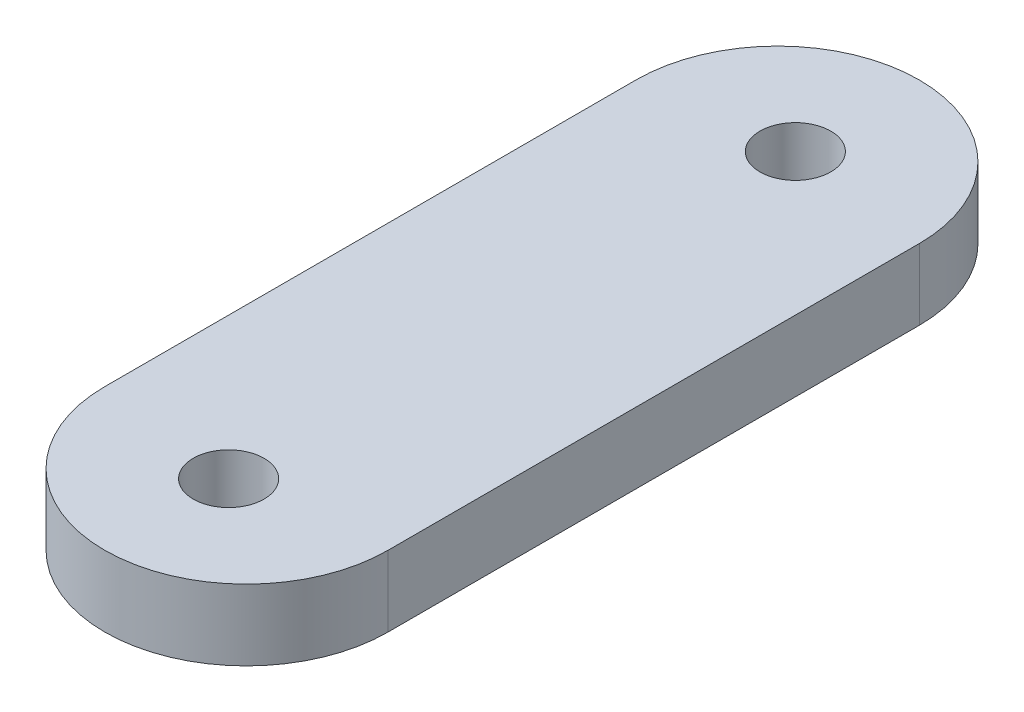
ISO-10303-21;
HEADER;
FILE_DESCRIPTION(('STEP AP214'),'2;1');
FILE_NAME('part.step','',(''),(''),'','','');
FILE_SCHEMA(('AUTOMOTIVE_DESIGN { 1 0 10303 214 1 1 1 1 }'));
ENDSEC;
DATA;
#1=APPLICATION_CONTEXT('core data for automotive mechanical design processes');
#2=APPLICATION_PROTOCOL_DEFINITION('international standard','automotive_design',2000,#1);
#3=PRODUCT_CONTEXT('',#1,'mechanical');
#4=PRODUCT('Part','Part','',(#3));
#5=PRODUCT_RELATED_PRODUCT_CATEGORY('part','',(#4));
#6=PRODUCT_DEFINITION_FORMATION('','',#4);
#7=PRODUCT_DEFINITION_CONTEXT('part definition',#1,'design');
#8=PRODUCT_DEFINITION('design','',#6,#7);
#9=PRODUCT_DEFINITION_SHAPE('','',#8);
#10=(LENGTH_UNIT() NAMED_UNIT(*) SI_UNIT(.MILLI.,.METRE.));
#11=(NAMED_UNIT(*) PLANE_ANGLE_UNIT() SI_UNIT($,.RADIAN.));
#12=(NAMED_UNIT(*) SI_UNIT($,.STERADIAN.) SOLID_ANGLE_UNIT());
#13=UNCERTAINTY_MEASURE_WITH_UNIT(LENGTH_MEASURE(1.E-05),#10,'distance_accuracy_value','');
#14=(GEOMETRIC_REPRESENTATION_CONTEXT(3) GLOBAL_UNCERTAINTY_ASSIGNED_CONTEXT((#13)) GLOBAL_UNIT_ASSIGNED_CONTEXT((#10,
#11,#12)) REPRESENTATION_CONTEXT('',''));
#15=CARTESIAN_POINT('',(0.,0.,0.));
#16=DIRECTION('',(0.,0.,1.));
#17=DIRECTION('',(1.,0.,0.));
#18=AXIS2_PLACEMENT_3D('',#15,#16,#17);
#19=CARTESIAN_POINT('',(0.,0.,-15.));
#20=DIRECTION('',(0.,-1.,0.));
#21=DIRECTION('',(0.,0.,-1.));
#22=AXIS2_PLACEMENT_3D('',#19,#20,#21);
#23=CYLINDRICAL_SURFACE('',#22,8.);
#24=DIRECTION('',(0.,-1.,0.));
#25=VECTOR('',#24,1.);
#26=CARTESIAN_POINT('',(8.,4.,-15.));
#27=LINE('',#26,#25);
#28=CARTESIAN_POINT('',(8.,0.,-15.));
#29=VERTEX_POINT('',#28);
#30=CARTESIAN_POINT('',(8.,4.,-15.));
#31=VERTEX_POINT('',#30);
#32=EDGE_CURVE('E85',#29,#31,#27,.F.);
#33=ORIENTED_EDGE('',*,*,#32,.F.);
#34=CARTESIAN_POINT('',(0.,0.,-15.));
#35=DIRECTION('',(0.,1.,0.));
#36=DIRECTION('',(0.,0.,1.));
#37=AXIS2_PLACEMENT_3D('',#34,#35,#36);
#38=CIRCLE('',#37,8.);
#39=CARTESIAN_POINT('',(-8.,0.,-15.));
#40=VERTEX_POINT('',#39);
#41=EDGE_CURVE('E43',#40,#29,#38,.F.);
#42=ORIENTED_EDGE('',*,*,#41,.F.);
#43=DIRECTION('',(0.,-1.,0.));
#44=VECTOR('',#43,1.);
#45=CARTESIAN_POINT('',(-8.,4.,-15.));
#46=LINE('',#45,#44);
#47=CARTESIAN_POINT('',(-8.,4.,-15.));
#48=VERTEX_POINT('',#47);
#49=EDGE_CURVE('E108',#48,#40,#46,.T.);
#50=ORIENTED_EDGE('',*,*,#49,.F.);
#51=CARTESIAN_POINT('',(0.,4.,-15.));
#52=DIRECTION('',(0.,1.,0.));
#53=DIRECTION('',(0.,0.,1.));
#54=AXIS2_PLACEMENT_3D('',#51,#52,#53);
#55=CIRCLE('',#54,8.);
#56=EDGE_CURVE('E11',#31,#48,#55,.T.);
#57=ORIENTED_EDGE('',*,*,#56,.F.);
#58=EDGE_LOOP('',(#33,#42,#50,#57));
#59=FACE_BOUND('',#58,.T.);
#60=ADVANCED_FACE('F35',(#59),#23,.T.);
#61=CARTESIAN_POINT('',(0.,4.,15.));
#62=DIRECTION('',(0.,-1.,0.));
#63=DIRECTION('',(0.,0.,-1.));
#64=AXIS2_PLACEMENT_3D('',#61,#62,#63);
#65=CYLINDRICAL_SURFACE('',#64,8.);
#66=DIRECTION('',(0.,-1.,0.));
#67=VECTOR('',#66,1.);
#68=CARTESIAN_POINT('',(8.,4.,15.));
#69=LINE('',#68,#67);
#70=CARTESIAN_POINT('',(8.,4.,15.));
#71=VERTEX_POINT('',#70);
#72=CARTESIAN_POINT('',(8.,0.,15.));
#73=VERTEX_POINT('',#72);
#74=EDGE_CURVE('E78',#71,#73,#69,.T.);
#75=ORIENTED_EDGE('',*,*,#74,.F.);
#76=CARTESIAN_POINT('',(0.,4.,15.));
#77=DIRECTION('',(0.,1.,0.));
#78=DIRECTION('',(0.,0.,1.));
#79=AXIS2_PLACEMENT_3D('',#76,#77,#78);
#80=CIRCLE('',#79,8.);
#81=CARTESIAN_POINT('',(-8.,4.,15.));
#82=VERTEX_POINT('',#81);
#83=EDGE_CURVE('E86',#82,#71,#80,.T.);
#84=ORIENTED_EDGE('',*,*,#83,.F.);
#85=DIRECTION('',(0.,-1.,0.));
#86=VECTOR('',#85,1.);
#87=CARTESIAN_POINT('',(-8.,4.,15.));
#88=LINE('',#87,#86);
#89=CARTESIAN_POINT('',(-8.,0.,15.));
#90=VERTEX_POINT('',#89);
#91=EDGE_CURVE('E81',#90,#82,#88,.F.);
#92=ORIENTED_EDGE('',*,*,#91,.F.);
#93=CARTESIAN_POINT('',(0.,0.,15.));
#94=DIRECTION('',(0.,1.,0.));
#95=DIRECTION('',(0.,0.,1.));
#96=AXIS2_PLACEMENT_3D('',#93,#94,#95);
#97=CIRCLE('',#96,8.);
#98=EDGE_CURVE('E74',#73,#90,#97,.F.);
#99=ORIENTED_EDGE('',*,*,#98,.F.);
#100=EDGE_LOOP('',(#75,#84,#92,#99));
#101=FACE_BOUND('',#100,.T.);
#102=ADVANCED_FACE('F76',(#101),#65,.T.);
#103=CARTESIAN_POINT('',(0.,4.,0.));
#104=DIRECTION('',(0.,1.,0.));
#105=DIRECTION('',(0.,0.,1.));
#106=AXIS2_PLACEMENT_3D('',#103,#104,#105);
#107=PLANE('',#106);
#108=CARTESIAN_POINT('',(0.,4.,16.));
#109=DIRECTION('',(0.,1.,0.));
#110=DIRECTION('',(0.,0.,1.));
#111=AXIS2_PLACEMENT_3D('',#108,#109,#110);
#112=CIRCLE('',#111,2.);
#113=CARTESIAN_POINT('',(0.,4.,18.));
#114=VERTEX_POINT('',#113);
#115=EDGE_CURVE('E101',#114,#114,#112,.T.);
#116=ORIENTED_EDGE('',*,*,#115,.F.);
#117=EDGE_LOOP('',(#116));
#118=FACE_BOUND('',#117,.T.);
#119=DIRECTION('',(0.,0.,-1.));
#120=VECTOR('',#119,1.);
#121=CARTESIAN_POINT('',(8.,4.,23.));
#122=LINE('',#121,#120);
#123=EDGE_CURVE('E93',#71,#31,#122,.T.);
#124=ORIENTED_EDGE('',*,*,#123,.T.);
#125=ORIENTED_EDGE('',*,*,#56,.T.);
#126=DIRECTION('',(0.,0.,1.));
#127=VECTOR('',#126,1.);
#128=CARTESIAN_POINT('',(-8.,4.,23.));
#129=LINE('',#128,#127);
#130=EDGE_CURVE('E97',#48,#82,#129,.T.);
#131=ORIENTED_EDGE('',*,*,#130,.T.);
#132=ORIENTED_EDGE('',*,*,#83,.T.);
#133=EDGE_LOOP('',(#124,#125,#131,#132));
#134=FACE_BOUND('',#133,.T.);
#135=CARTESIAN_POINT('',(0.,4.,-16.));
#136=DIRECTION('',(0.,1.,0.));
#137=DIRECTION('',(0.,0.,1.));
#138=AXIS2_PLACEMENT_3D('',#135,#136,#137);
#139=CIRCLE('',#138,2.);
#140=CARTESIAN_POINT('',(0.,4.,-14.));
#141=VERTEX_POINT('',#140);
#142=EDGE_CURVE('E118',#141,#141,#139,.T.);
#143=ORIENTED_EDGE('',*,*,#142,.F.);
#144=EDGE_LOOP('',(#143));
#145=FACE_BOUND('',#144,.T.);
#146=ADVANCED_FACE('F112',(#118,#134,#145),#107,.T.);
#147=CARTESIAN_POINT('',(0.,0.,0.));
#148=DIRECTION('',(0.,1.,0.));
#149=DIRECTION('',(0.,0.,1.));
#150=AXIS2_PLACEMENT_3D('',#147,#148,#149);
#151=PLANE('',#150);
#152=DIRECTION('',(0.,0.,1.));
#153=VECTOR('',#152,1.);
#154=CARTESIAN_POINT('',(-8.,0.,23.));
#155=LINE('',#154,#153);
#156=EDGE_CURVE('E98',#40,#90,#155,.T.);
#157=ORIENTED_EDGE('',*,*,#156,.F.);
#158=ORIENTED_EDGE('',*,*,#41,.T.);
#159=DIRECTION('',(0.,0.,-1.));
#160=VECTOR('',#159,1.);
#161=CARTESIAN_POINT('',(8.,0.,23.));
#162=LINE('',#161,#160);
#163=EDGE_CURVE('E92',#73,#29,#162,.T.);
#164=ORIENTED_EDGE('',*,*,#163,.F.);
#165=ORIENTED_EDGE('',*,*,#98,.T.);
#166=EDGE_LOOP('',(#157,#158,#164,#165));
#167=FACE_BOUND('',#166,.T.);
#168=CARTESIAN_POINT('',(0.,0.,16.));
#169=DIRECTION('',(0.,1.,0.));
#170=DIRECTION('',(0.,0.,1.));
#171=AXIS2_PLACEMENT_3D('',#168,#169,#170);
#172=CIRCLE('',#171,2.);
#173=CARTESIAN_POINT('',(0.,0.,18.));
#174=VERTEX_POINT('',#173);
#175=EDGE_CURVE('E115',#174,#174,#172,.T.);
#176=ORIENTED_EDGE('',*,*,#175,.T.);
#177=EDGE_LOOP('',(#176));
#178=FACE_BOUND('',#177,.T.);
#179=CARTESIAN_POINT('',(0.,0.,-16.));
#180=DIRECTION('',(0.,1.,0.));
#181=DIRECTION('',(0.,0.,1.));
#182=AXIS2_PLACEMENT_3D('',#179,#180,#181);
#183=CIRCLE('',#182,2.);
#184=CARTESIAN_POINT('',(0.,0.,-14.));
#185=VERTEX_POINT('',#184);
#186=EDGE_CURVE('E121',#185,#185,#183,.T.);
#187=ORIENTED_EDGE('',*,*,#186,.T.);
#188=EDGE_LOOP('',(#187));
#189=FACE_BOUND('',#188,.T.);
#190=ADVANCED_FACE('F95',(#167,#178,#189),#151,.F.);
#191=CARTESIAN_POINT('',(-8.,4.,23.));
#192=DIRECTION('',(1.,0.,0.));
#193=DIRECTION('',(0.,0.,-1.));
#194=AXIS2_PLACEMENT_3D('',#191,#192,#193);
#195=PLANE('',#194);
#196=ORIENTED_EDGE('',*,*,#130,.F.);
#197=ORIENTED_EDGE('',*,*,#49,.T.);
#198=ORIENTED_EDGE('',*,*,#156,.T.);
#199=ORIENTED_EDGE('',*,*,#91,.T.);
#200=EDGE_LOOP('',(#196,#197,#198,#199));
#201=FACE_BOUND('',#200,.T.);
#202=ADVANCED_FACE('F111',(#201),#195,.F.);
#203=CARTESIAN_POINT('',(8.,4.,23.));
#204=DIRECTION('',(-1.,0.,0.));
#205=DIRECTION('',(0.,0.,1.));
#206=AXIS2_PLACEMENT_3D('',#203,#204,#205);
#207=PLANE('',#206);
#208=ORIENTED_EDGE('',*,*,#163,.T.);
#209=ORIENTED_EDGE('',*,*,#32,.T.);
#210=ORIENTED_EDGE('',*,*,#123,.F.);
#211=ORIENTED_EDGE('',*,*,#74,.T.);
#212=EDGE_LOOP('',(#208,#209,#210,#211));
#213=FACE_BOUND('',#212,.T.);
#214=ADVANCED_FACE('F90',(#213),#207,.F.);
#215=CARTESIAN_POINT('',(0.,4.,16.));
#216=DIRECTION('',(0.,-1.,0.));
#217=DIRECTION('',(0.,0.,-1.));
#218=AXIS2_PLACEMENT_3D('',#215,#216,#217);
#219=CYLINDRICAL_SURFACE('',#218,2.);
#220=ORIENTED_EDGE('',*,*,#115,.T.);
#221=EDGE_LOOP('',(#220));
#222=FACE_BOUND('',#221,.T.);
#223=ORIENTED_EDGE('',*,*,#175,.F.);
#224=EDGE_LOOP('',(#223));
#225=FACE_BOUND('',#224,.T.);
#226=ADVANCED_FACE('F155',(#222,#225),#219,.F.);
#227=CARTESIAN_POINT('',(0.,4.,-16.));
#228=DIRECTION('',(0.,-1.,0.));
#229=DIRECTION('',(0.,0.,-1.));
#230=AXIS2_PLACEMENT_3D('',#227,#228,#229);
#231=CYLINDRICAL_SURFACE('',#230,2.);
#232=ORIENTED_EDGE('',*,*,#142,.T.);
#233=EDGE_LOOP('',(#232));
#234=FACE_BOUND('',#233,.T.);
#235=ORIENTED_EDGE('',*,*,#186,.F.);
#236=EDGE_LOOP('',(#235));
#237=FACE_BOUND('',#236,.T.);
#238=ADVANCED_FACE('F127',(#234,#237),#231,.F.);
#239=CLOSED_SHELL('',(#60,#102,#146,#190,#202,#214,#226,#238));
#240=MANIFOLD_SOLID_BREP('B2',#239);
#241=ADVANCED_BREP_SHAPE_REPRESENTATION('',(#18,#240),#14);
#242=SHAPE_DEFINITION_REPRESENTATION(#9,#241);
ENDSEC;
END-ISO-10303-21;
